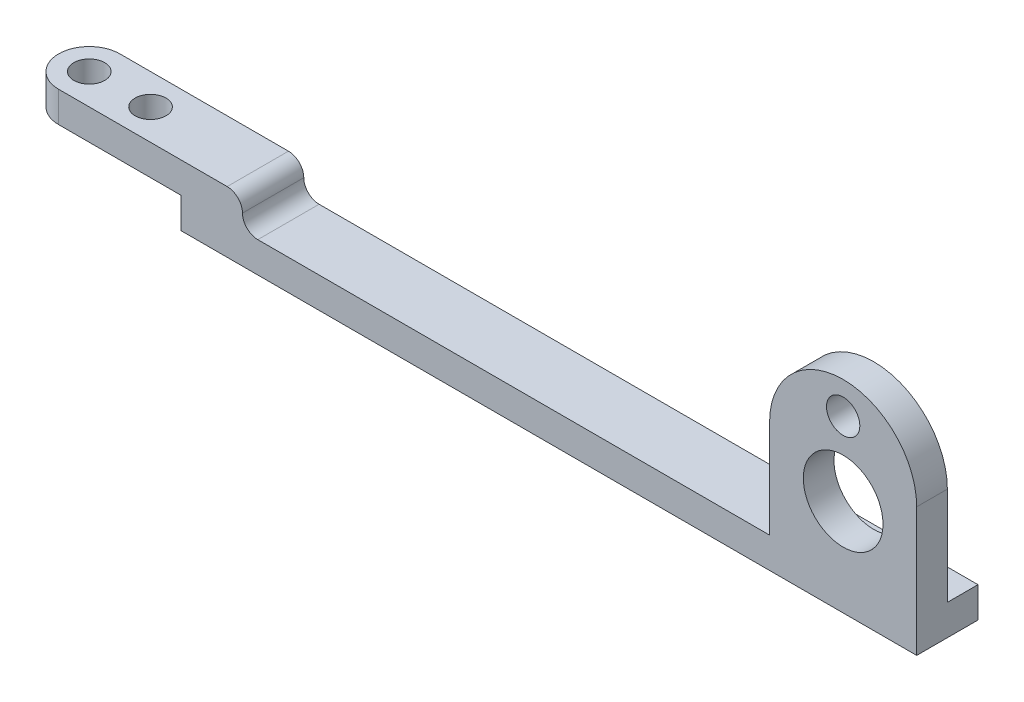
ISO-10303-21;
HEADER;
FILE_DESCRIPTION(('STEP AP214'),'2;1');
FILE_NAME('part.step','',(''),(''),'','','');
FILE_SCHEMA(('AUTOMOTIVE_DESIGN { 1 0 10303 214 1 1 1 1 }'));
ENDSEC;
DATA;
#1=APPLICATION_CONTEXT('core data for automotive mechanical design processes');
#2=APPLICATION_PROTOCOL_DEFINITION('international standard','automotive_design',2000,#1);
#3=PRODUCT_CONTEXT('',#1,'mechanical');
#4=PRODUCT('Part','Part','',(#3));
#5=PRODUCT_RELATED_PRODUCT_CATEGORY('part','',(#4));
#6=PRODUCT_DEFINITION_FORMATION('','',#4);
#7=PRODUCT_DEFINITION_CONTEXT('part definition',#1,'design');
#8=PRODUCT_DEFINITION('design','',#6,#7);
#9=PRODUCT_DEFINITION_SHAPE('','',#8);
#10=(LENGTH_UNIT() NAMED_UNIT(*) SI_UNIT(.MILLI.,.METRE.));
#11=(NAMED_UNIT(*) PLANE_ANGLE_UNIT() SI_UNIT($,.RADIAN.));
#12=(NAMED_UNIT(*) SI_UNIT($,.STERADIAN.) SOLID_ANGLE_UNIT());
#13=UNCERTAINTY_MEASURE_WITH_UNIT(LENGTH_MEASURE(1.E-05),#10,'distance_accuracy_value','');
#14=(GEOMETRIC_REPRESENTATION_CONTEXT(3) GLOBAL_UNCERTAINTY_ASSIGNED_CONTEXT((#13)) GLOBAL_UNIT_ASSIGNED_CONTEXT((#10,
#11,#12)) REPRESENTATION_CONTEXT('',''));
#15=CARTESIAN_POINT('',(0.,0.,0.));
#16=DIRECTION('',(0.,0.,1.));
#17=DIRECTION('',(1.,0.,0.));
#18=AXIS2_PLACEMENT_3D('',#15,#16,#17);
#19=CARTESIAN_POINT('',(0.,3.175,-3.175));
#20=DIRECTION('',(1.,0.,0.));
#21=DIRECTION('',(0.,0.,-1.));
#22=AXIS2_PLACEMENT_3D('',#19,#20,#21);
#23=PLANE('',#22);
#24=DIRECTION('',(0.,0.,1.));
#25=VECTOR('',#24,1.);
#26=CARTESIAN_POINT('',(0.,0.,-3.175));
#27=LINE('',#26,#25);
#28=CARTESIAN_POINT('',(0.,0.,-3.175));
#29=VERTEX_POINT('',#28);
#30=CARTESIAN_POINT('',(0.,0.,3.175));
#31=VERTEX_POINT('',#30);
#32=EDGE_CURVE('E203',#29,#31,#27,.T.);
#33=ORIENTED_EDGE('',*,*,#32,.T.);
#34=DIRECTION('',(0.,-1.,0.));
#35=VECTOR('',#34,1.);
#36=CARTESIAN_POINT('',(0.,3.175,3.175));
#37=LINE('',#36,#35);
#38=CARTESIAN_POINT('',(0.,3.175,3.175));
#39=VERTEX_POINT('',#38);
#40=EDGE_CURVE('E229',#39,#31,#37,.T.);
#41=ORIENTED_EDGE('',*,*,#40,.F.);
#42=DIRECTION('',(0.,0.,1.));
#43=VECTOR('',#42,1.);
#44=CARTESIAN_POINT('',(0.,3.175,-3.175));
#45=LINE('',#44,#43);
#46=CARTESIAN_POINT('',(0.,3.175,-3.175));
#47=VERTEX_POINT('',#46);
#48=EDGE_CURVE('E204',#47,#39,#45,.T.);
#49=ORIENTED_EDGE('',*,*,#48,.F.);
#50=DIRECTION('',(0.,-1.,0.));
#51=VECTOR('',#50,1.);
#52=CARTESIAN_POINT('',(0.,3.175,-3.175));
#53=LINE('',#52,#51);
#54=EDGE_CURVE('E214',#47,#29,#53,.T.);
#55=ORIENTED_EDGE('',*,*,#54,.T.);
#56=EDGE_LOOP('',(#33,#41,#49,#55));
#57=FACE_BOUND('',#56,.T.);
#58=ADVANCED_FACE('F45',(#57),#23,.F.);
#59=CARTESIAN_POINT('',(0.,3.175,3.175));
#60=DIRECTION('',(0.,0.,-1.));
#61=DIRECTION('',(-1.,0.,0.));
#62=AXIS2_PLACEMENT_3D('',#59,#60,#61);
#63=PLANE('',#62);
#64=DIRECTION('',(1.,0.,0.));
#65=VECTOR('',#64,1.);
#66=CARTESIAN_POINT('',(0.,3.175,3.175));
#67=LINE('',#66,#65);
#68=CARTESIAN_POINT('',(7.9375,3.175,3.175));
#69=VERTEX_POINT('',#68);
#70=CARTESIAN_POINT('',(60.96,3.175,3.175));
#71=VERTEX_POINT('',#70);
#72=EDGE_CURVE('E207',#69,#71,#67,.T.);
#73=ORIENTED_EDGE('',*,*,#72,.F.);
#74=CARTESIAN_POINT('',(7.9375,4.7625,3.175));
#75=DIRECTION('',(0.,0.,-1.));
#76=DIRECTION('',(-1.,0.,0.));
#77=AXIS2_PLACEMENT_3D('',#74,#75,#76);
#78=CIRCLE('',#77,1.5875);
#79=CARTESIAN_POINT('',(6.35,4.7625,3.175));
#80=VERTEX_POINT('',#79);
#81=EDGE_CURVE('E243',#69,#80,#78,.T.);
#82=ORIENTED_EDGE('',*,*,#81,.T.);
#83=CARTESIAN_POINT('',(4.7625,4.7625,3.175));
#84=DIRECTION('',(0.,0.,-1.));
#85=DIRECTION('',(-1.,0.,0.));
#86=AXIS2_PLACEMENT_3D('',#83,#84,#85);
#87=CIRCLE('',#86,1.5875);
#88=CARTESIAN_POINT('',(4.7625,6.35,3.175));
#89=VERTEX_POINT('',#88);
#90=EDGE_CURVE('E239',#80,#89,#87,.F.);
#91=ORIENTED_EDGE('',*,*,#90,.T.);
#92=DIRECTION('',(1.,0.,0.));
#93=VECTOR('',#92,1.);
#94=CARTESIAN_POINT('',(6.35,6.35,3.175));
#95=LINE('',#94,#93);
#96=CARTESIAN_POINT('',(-12.7,6.35,3.175));
#97=VERTEX_POINT('',#96);
#98=EDGE_CURVE('E189',#97,#89,#95,.T.);
#99=ORIENTED_EDGE('',*,*,#98,.F.);
#100=DIRECTION('',(0.,-1.,0.));
#101=VECTOR('',#100,1.);
#102=CARTESIAN_POINT('',(-12.7,6.35,3.175));
#103=LINE('',#102,#101);
#104=CARTESIAN_POINT('',(-12.7,3.175,3.175));
#105=VERTEX_POINT('',#104);
#106=EDGE_CURVE('E192',#97,#105,#103,.T.);
#107=ORIENTED_EDGE('',*,*,#106,.T.);
#108=DIRECTION('',(1.,0.,0.));
#109=VECTOR('',#108,1.);
#110=CARTESIAN_POINT('',(6.35,3.175,3.175));
#111=LINE('',#110,#109);
#112=EDGE_CURVE('E187',#105,#39,#111,.T.);
#113=ORIENTED_EDGE('',*,*,#112,.T.);
#114=ORIENTED_EDGE('',*,*,#40,.T.);
#115=DIRECTION('',(1.,0.,0.));
#116=VECTOR('',#115,1.);
#117=CARTESIAN_POINT('',(0.,0.,3.175));
#118=LINE('',#117,#116);
#119=CARTESIAN_POINT('',(76.2,0.,3.175));
#120=VERTEX_POINT('',#119);
#121=EDGE_CURVE('E217',#31,#120,#118,.T.);
#122=ORIENTED_EDGE('',*,*,#121,.T.);
#123=DIRECTION('',(0.,-1.,0.));
#124=VECTOR('',#123,1.);
#125=CARTESIAN_POINT('',(76.2,3.175,3.175));
#126=LINE('',#125,#124);
#127=CARTESIAN_POINT('',(76.2,13.335,3.175));
#128=VERTEX_POINT('',#127);
#129=EDGE_CURVE('E227',#128,#120,#126,.T.);
#130=ORIENTED_EDGE('',*,*,#129,.F.);
#131=CARTESIAN_POINT('',(68.58,13.335,3.175));
#132=DIRECTION('',(0.,0.,1.));
#133=DIRECTION('',(-1.,0.,0.));
#134=AXIS2_PLACEMENT_3D('',#131,#132,#133);
#135=CIRCLE('',#134,7.62000000000001);
#136=CARTESIAN_POINT('',(60.96,13.335,3.175));
#137=VERTEX_POINT('',#136);
#138=EDGE_CURVE('E140',#128,#137,#135,.T.);
#139=ORIENTED_EDGE('',*,*,#138,.T.);
#140=DIRECTION('',(0.,-1.,0.));
#141=VECTOR('',#140,1.);
#142=CARTESIAN_POINT('',(60.96,3.175,3.175));
#143=LINE('',#142,#141);
#144=EDGE_CURVE('E156',#137,#71,#143,.T.);
#145=ORIENTED_EDGE('',*,*,#144,.T.);
#146=EDGE_LOOP('',(#73,#82,#91,#99,#107,#113,#114,#122,#130,#139,#145));
#147=FACE_BOUND('',#146,.T.);
#148=CARTESIAN_POINT('',(68.58,17.653,3.175));
#149=DIRECTION('',(0.,0.,1.));
#150=DIRECTION('',(1.,0.,0.));
#151=AXIS2_PLACEMENT_3D('',#148,#149,#150);
#152=CIRCLE('',#151,1.725);
#153=CARTESIAN_POINT('',(70.305,17.653,3.175));
#154=VERTEX_POINT('',#153);
#155=EDGE_CURVE('E464',#154,#154,#152,.T.);
#156=ORIENTED_EDGE('',*,*,#155,.F.);
#157=EDGE_LOOP('',(#156));
#158=FACE_BOUND('',#157,.T.);
#159=CARTESIAN_POINT('',(68.58,10.033,3.175));
#160=DIRECTION('',(0.,0.,1.));
#161=DIRECTION('',(1.,0.,0.));
#162=AXIS2_PLACEMENT_3D('',#159,#160,#161);
#163=CIRCLE('',#162,4.12750000000001);
#164=CARTESIAN_POINT('',(72.7075,10.033,3.175));
#165=VERTEX_POINT('',#164);
#166=EDGE_CURVE('E161',#165,#165,#163,.T.);
#167=ORIENTED_EDGE('',*,*,#166,.F.);
#168=EDGE_LOOP('',(#167));
#169=FACE_BOUND('',#168,.T.);
#170=ADVANCED_FACE('F262',(#147,#158,#169),#63,.F.);
#171=CARTESIAN_POINT('',(76.2,3.175,-3.175));
#172=DIRECTION('',(-1.,0.,0.));
#173=DIRECTION('',(0.,0.,1.));
#174=AXIS2_PLACEMENT_3D('',#171,#172,#173);
#175=PLANE('',#174);
#176=DIRECTION('',(0.,0.,-1.));
#177=VECTOR('',#176,1.);
#178=CARTESIAN_POINT('',(76.2,0.,-3.175));
#179=LINE('',#178,#177);
#180=CARTESIAN_POINT('',(76.2,0.,-3.175));
#181=VERTEX_POINT('',#180);
#182=EDGE_CURVE('E219',#120,#181,#179,.T.);
#183=ORIENTED_EDGE('',*,*,#182,.T.);
#184=DIRECTION('',(0.,-1.,0.));
#185=VECTOR('',#184,1.);
#186=CARTESIAN_POINT('',(76.2,3.175,-3.175));
#187=LINE('',#186,#185);
#188=CARTESIAN_POINT('',(76.2,3.175,-3.175));
#189=VERTEX_POINT('',#188);
#190=EDGE_CURVE('E224',#189,#181,#187,.T.);
#191=ORIENTED_EDGE('',*,*,#190,.F.);
#192=DIRECTION('',(0.,0.,-1.));
#193=VECTOR('',#192,1.);
#194=CARTESIAN_POINT('',(76.2,3.175,-3.175));
#195=LINE('',#194,#193);
#196=CARTESIAN_POINT('',(76.2,3.175,0.));
#197=VERTEX_POINT('',#196);
#198=EDGE_CURVE('E155',#197,#189,#195,.T.);
#199=ORIENTED_EDGE('',*,*,#198,.F.);
#200=DIRECTION('',(0.,1.,0.));
#201=VECTOR('',#200,1.);
#202=CARTESIAN_POINT('',(76.2,3.175,0.));
#203=LINE('',#202,#201);
#204=CARTESIAN_POINT('',(76.2,13.335,0.));
#205=VERTEX_POINT('',#204);
#206=EDGE_CURVE('E150',#197,#205,#203,.T.);
#207=ORIENTED_EDGE('',*,*,#206,.T.);
#208=DIRECTION('',(0.,0.,1.));
#209=VECTOR('',#208,1.);
#210=CARTESIAN_POINT('',(76.2,13.335,0.));
#211=LINE('',#210,#209);
#212=EDGE_CURVE('E135',#205,#128,#211,.T.);
#213=ORIENTED_EDGE('',*,*,#212,.T.);
#214=ORIENTED_EDGE('',*,*,#129,.T.);
#215=EDGE_LOOP('',(#183,#191,#199,#207,#213,#214));
#216=FACE_BOUND('',#215,.T.);
#217=ADVANCED_FACE('F153',(#216),#175,.F.);
#218=CARTESIAN_POINT('',(0.,3.175,-3.175));
#219=DIRECTION('',(0.,0.,1.));
#220=DIRECTION('',(1.,0.,0.));
#221=AXIS2_PLACEMENT_3D('',#218,#219,#220);
#222=PLANE('',#221);
#223=DIRECTION('',(-1.,0.,0.));
#224=VECTOR('',#223,1.);
#225=CARTESIAN_POINT('',(6.34999999999999,6.35,-3.175));
#226=LINE('',#225,#224);
#227=CARTESIAN_POINT('',(4.76249999999999,6.35,-3.175));
#228=VERTEX_POINT('',#227);
#229=CARTESIAN_POINT('',(-12.7,6.35,-3.175));
#230=VERTEX_POINT('',#229);
#231=EDGE_CURVE('E184',#228,#230,#226,.T.);
#232=ORIENTED_EDGE('',*,*,#231,.F.);
#233=CARTESIAN_POINT('',(4.76249999999999,4.7625,-3.175));
#234=DIRECTION('',(0.,0.,1.));
#235=DIRECTION('',(1.,0.,0.));
#236=AXIS2_PLACEMENT_3D('',#233,#234,#235);
#237=CIRCLE('',#236,1.5875);
#238=CARTESIAN_POINT('',(6.34999999999999,4.7625,-3.175));
#239=VERTEX_POINT('',#238);
#240=EDGE_CURVE('E237',#228,#239,#237,.F.);
#241=ORIENTED_EDGE('',*,*,#240,.T.);
#242=CARTESIAN_POINT('',(7.93749999999999,4.7625,-3.175));
#243=DIRECTION('',(0.,0.,1.));
#244=DIRECTION('',(1.,0.,0.));
#245=AXIS2_PLACEMENT_3D('',#242,#243,#244);
#246=CIRCLE('',#245,1.5875);
#247=CARTESIAN_POINT('',(7.93749999999999,3.175,-3.175));
#248=VERTEX_POINT('',#247);
#249=EDGE_CURVE('E241',#239,#248,#246,.T.);
#250=ORIENTED_EDGE('',*,*,#249,.T.);
#251=DIRECTION('',(-1.,0.,0.));
#252=VECTOR('',#251,1.);
#253=CARTESIAN_POINT('',(0.,3.175,-3.175));
#254=LINE('',#253,#252);
#255=EDGE_CURVE('E211',#189,#248,#254,.T.);
#256=ORIENTED_EDGE('',*,*,#255,.F.);
#257=ORIENTED_EDGE('',*,*,#190,.T.);
#258=DIRECTION('',(-1.,0.,0.));
#259=VECTOR('',#258,1.);
#260=CARTESIAN_POINT('',(0.,0.,-3.175));
#261=LINE('',#260,#259);
#262=EDGE_CURVE('E208',#181,#29,#261,.T.);
#263=ORIENTED_EDGE('',*,*,#262,.T.);
#264=ORIENTED_EDGE('',*,*,#54,.F.);
#265=DIRECTION('',(-1.,0.,0.));
#266=VECTOR('',#265,1.);
#267=CARTESIAN_POINT('',(6.34999999999999,3.175,-3.175));
#268=LINE('',#267,#266);
#269=CARTESIAN_POINT('',(-12.7,3.175,-3.175));
#270=VERTEX_POINT('',#269);
#271=EDGE_CURVE('E181',#47,#270,#268,.T.);
#272=ORIENTED_EDGE('',*,*,#271,.T.);
#273=DIRECTION('',(0.,-1.,0.));
#274=VECTOR('',#273,1.);
#275=CARTESIAN_POINT('',(-12.7,6.35,-3.175));
#276=LINE('',#275,#274);
#277=EDGE_CURVE('E200',#230,#270,#276,.T.);
#278=ORIENTED_EDGE('',*,*,#277,.F.);
#279=EDGE_LOOP('',(#232,#241,#250,#256,#257,#263,#264,#272,#278));
#280=FACE_BOUND('',#279,.T.);
#281=ADVANCED_FACE('F300',(#280),#222,.F.);
#282=CARTESIAN_POINT('',(0.,3.175,0.));
#283=DIRECTION('',(0.,1.,0.));
#284=DIRECTION('',(0.,0.,1.));
#285=AXIS2_PLACEMENT_3D('',#282,#283,#284);
#286=PLANE('',#285);
#287=DIRECTION('',(0.,0.,1.));
#288=VECTOR('',#287,1.);
#289=CARTESIAN_POINT('',(60.96,3.175,0.));
#290=LINE('',#289,#288);
#291=CARTESIAN_POINT('',(60.96,3.175,0.));
#292=VERTEX_POINT('',#291);
#293=EDGE_CURVE('E61',#292,#71,#290,.T.);
#294=ORIENTED_EDGE('',*,*,#293,.F.);
#295=DIRECTION('',(1.,0.,0.));
#296=VECTOR('',#295,1.);
#297=CARTESIAN_POINT('',(76.2,3.175,0.));
#298=LINE('',#297,#296);
#299=EDGE_CURVE('E66',#292,#197,#298,.T.);
#300=ORIENTED_EDGE('',*,*,#299,.T.);
#301=ORIENTED_EDGE('',*,*,#198,.T.);
#302=ORIENTED_EDGE('',*,*,#255,.T.);
#303=DIRECTION('',(0.,0.,-1.));
#304=VECTOR('',#303,1.);
#305=CARTESIAN_POINT('',(7.9375,3.175,0.));
#306=LINE('',#305,#304);
#307=EDGE_CURVE('E232',#248,#69,#306,.F.);
#308=ORIENTED_EDGE('',*,*,#307,.T.);
#309=ORIENTED_EDGE('',*,*,#72,.T.);
#310=EDGE_LOOP('',(#294,#300,#301,#302,#308,#309));
#311=FACE_BOUND('',#310,.T.);
#312=ADVANCED_FACE('F312',(#311),#286,.T.);
#313=CARTESIAN_POINT('',(0.,0.,0.));
#314=DIRECTION('',(0.,1.,0.));
#315=DIRECTION('',(0.,0.,1.));
#316=AXIS2_PLACEMENT_3D('',#313,#314,#315);
#317=PLANE('',#316);
#318=ORIENTED_EDGE('',*,*,#32,.F.);
#319=ORIENTED_EDGE('',*,*,#262,.F.);
#320=ORIENTED_EDGE('',*,*,#182,.F.);
#321=ORIENTED_EDGE('',*,*,#121,.F.);
#322=EDGE_LOOP('',(#318,#319,#320,#321));
#323=FACE_BOUND('',#322,.T.);
#324=ADVANCED_FACE('F318',(#323),#317,.F.);
#325=CARTESIAN_POINT('',(-12.7,3.175,0.));
#326=DIRECTION('',(0.,1.,0.));
#327=DIRECTION('',(0.,0.,1.));
#328=AXIS2_PLACEMENT_3D('',#325,#326,#327);
#329=PLANE('',#328);
#330=CARTESIAN_POINT('',(-12.7,3.175,0.));
#331=DIRECTION('',(0.,1.,0.));
#332=DIRECTION('',(0.,0.,1.));
#333=AXIS2_PLACEMENT_3D('',#330,#331,#332);
#334=CIRCLE('',#333,1.6);
#335=CARTESIAN_POINT('',(-12.7,3.175,1.6));
#336=VERTEX_POINT('',#335);
#337=EDGE_CURVE('E174',#336,#336,#334,.T.);
#338=ORIENTED_EDGE('',*,*,#337,.T.);
#339=EDGE_LOOP('',(#338));
#340=FACE_BOUND('',#339,.T.);
#341=CARTESIAN_POINT('',(-6.35,3.175,0.));
#342=DIRECTION('',(0.,1.,0.));
#343=DIRECTION('',(0.,0.,1.));
#344=AXIS2_PLACEMENT_3D('',#341,#342,#343);
#345=CIRCLE('',#344,1.6);
#346=CARTESIAN_POINT('',(-6.35,3.175,1.6));
#347=VERTEX_POINT('',#346);
#348=EDGE_CURVE('E175',#347,#347,#345,.T.);
#349=ORIENTED_EDGE('',*,*,#348,.T.);
#350=EDGE_LOOP('',(#349));
#351=FACE_BOUND('',#350,.T.);
#352=ORIENTED_EDGE('',*,*,#271,.F.);
#353=ORIENTED_EDGE('',*,*,#48,.T.);
#354=ORIENTED_EDGE('',*,*,#112,.F.);
#355=CARTESIAN_POINT('',(-12.7,3.175,0.));
#356=DIRECTION('',(0.,1.,0.));
#357=DIRECTION('',(0.,0.,1.));
#358=AXIS2_PLACEMENT_3D('',#355,#356,#357);
#359=CIRCLE('',#358,3.175);
#360=EDGE_CURVE('E194',#270,#105,#359,.T.);
#361=ORIENTED_EDGE('',*,*,#360,.F.);
#362=EDGE_LOOP('',(#352,#353,#354,#361));
#363=FACE_BOUND('',#362,.T.);
#364=ADVANCED_FACE('F321',(#340,#351,#363),#329,.F.);
#365=CARTESIAN_POINT('',(-12.7,6.35,0.));
#366=DIRECTION('',(0.,1.,0.));
#367=DIRECTION('',(0.,0.,1.));
#368=AXIS2_PLACEMENT_3D('',#365,#366,#367);
#369=PLANE('',#368);
#370=CARTESIAN_POINT('',(-12.7,6.35,0.));
#371=DIRECTION('',(0.,1.,0.));
#372=DIRECTION('',(0.,0.,1.));
#373=AXIS2_PLACEMENT_3D('',#370,#371,#372);
#374=CIRCLE('',#373,1.6);
#375=CARTESIAN_POINT('',(-12.7,6.35,1.6));
#376=VERTEX_POINT('',#375);
#377=EDGE_CURVE('E178',#376,#376,#374,.T.);
#378=ORIENTED_EDGE('',*,*,#377,.F.);
#379=EDGE_LOOP('',(#378));
#380=FACE_BOUND('',#379,.T.);
#381=ORIENTED_EDGE('',*,*,#98,.T.);
#382=DIRECTION('',(0.,0.,-1.));
#383=VECTOR('',#382,1.);
#384=CARTESIAN_POINT('',(4.76249999999999,6.35,-3.175));
#385=LINE('',#384,#383);
#386=EDGE_CURVE('E235',#89,#228,#385,.T.);
#387=ORIENTED_EDGE('',*,*,#386,.T.);
#388=ORIENTED_EDGE('',*,*,#231,.T.);
#389=CARTESIAN_POINT('',(-12.7,6.35,0.));
#390=DIRECTION('',(0.,1.,0.));
#391=DIRECTION('',(0.,0.,1.));
#392=AXIS2_PLACEMENT_3D('',#389,#390,#391);
#393=CIRCLE('',#392,3.175);
#394=EDGE_CURVE('E186',#230,#97,#393,.T.);
#395=ORIENTED_EDGE('',*,*,#394,.T.);
#396=EDGE_LOOP('',(#381,#387,#388,#395));
#397=FACE_BOUND('',#396,.T.);
#398=CARTESIAN_POINT('',(-6.35,6.35,0.));
#399=DIRECTION('',(0.,1.,0.));
#400=DIRECTION('',(0.,0.,1.));
#401=AXIS2_PLACEMENT_3D('',#398,#399,#400);
#402=CIRCLE('',#401,1.6);
#403=CARTESIAN_POINT('',(-6.35,6.35,1.6));
#404=VERTEX_POINT('',#403);
#405=EDGE_CURVE('E171',#404,#404,#402,.T.);
#406=ORIENTED_EDGE('',*,*,#405,.F.);
#407=EDGE_LOOP('',(#406));
#408=FACE_BOUND('',#407,.T.);
#409=ADVANCED_FACE('F295',(#380,#397,#408),#369,.T.);
#410=CARTESIAN_POINT('',(-12.7,6.35,0.));
#411=DIRECTION('',(0.,-1.,0.));
#412=DIRECTION('',(0.,0.,-1.));
#413=AXIS2_PLACEMENT_3D('',#410,#411,#412);
#414=CYLINDRICAL_SURFACE('',#413,3.175);
#415=ORIENTED_EDGE('',*,*,#360,.T.);
#416=ORIENTED_EDGE('',*,*,#106,.F.);
#417=ORIENTED_EDGE('',*,*,#394,.F.);
#418=ORIENTED_EDGE('',*,*,#277,.T.);
#419=EDGE_LOOP('',(#415,#416,#417,#418));
#420=FACE_BOUND('',#419,.T.);
#421=ADVANCED_FACE('F306',(#420),#414,.T.);
#422=CARTESIAN_POINT('',(-12.7,6.35,0.));
#423=DIRECTION('',(0.,-1.,0.));
#424=DIRECTION('',(0.,0.,-1.));
#425=AXIS2_PLACEMENT_3D('',#422,#423,#424);
#426=CYLINDRICAL_SURFACE('',#425,1.6);
#427=ORIENTED_EDGE('',*,*,#377,.T.);
#428=EDGE_LOOP('',(#427));
#429=FACE_BOUND('',#428,.T.);
#430=ORIENTED_EDGE('',*,*,#337,.F.);
#431=EDGE_LOOP('',(#430));
#432=FACE_BOUND('',#431,.T.);
#433=ADVANCED_FACE('F286',(#429,#432),#426,.F.);
#434=CARTESIAN_POINT('',(-6.35,6.35,0.));
#435=DIRECTION('',(0.,-1.,0.));
#436=DIRECTION('',(0.,0.,-1.));
#437=AXIS2_PLACEMENT_3D('',#434,#435,#436);
#438=CYLINDRICAL_SURFACE('',#437,1.6);
#439=ORIENTED_EDGE('',*,*,#405,.T.);
#440=EDGE_LOOP('',(#439));
#441=FACE_BOUND('',#440,.T.);
#442=ORIENTED_EDGE('',*,*,#348,.F.);
#443=EDGE_LOOP('',(#442));
#444=FACE_BOUND('',#443,.T.);
#445=ADVANCED_FACE('F280',(#441,#444),#438,.F.);
#446=CARTESIAN_POINT('',(4.7625,4.7625,0.));
#447=DIRECTION('',(0.,0.,1.));
#448=DIRECTION('',(1.,0.,0.));
#449=AXIS2_PLACEMENT_3D('',#446,#447,#448);
#450=CYLINDRICAL_SURFACE('',#449,1.5875);
#451=ORIENTED_EDGE('',*,*,#386,.F.);
#452=ORIENTED_EDGE('',*,*,#90,.F.);
#453=DIRECTION('',(0.,0.,-1.));
#454=VECTOR('',#453,1.);
#455=CARTESIAN_POINT('',(6.35,4.7625,3.175));
#456=LINE('',#455,#454);
#457=EDGE_CURVE('E169',#239,#80,#456,.F.);
#458=ORIENTED_EDGE('',*,*,#457,.F.);
#459=ORIENTED_EDGE('',*,*,#240,.F.);
#460=EDGE_LOOP('',(#451,#452,#458,#459));
#461=FACE_BOUND('',#460,.T.);
#462=ADVANCED_FACE('F277',(#461),#450,.T.);
#463=CARTESIAN_POINT('',(7.93749999999999,4.7625,-3.175));
#464=DIRECTION('',(0.,0.,-1.));
#465=DIRECTION('',(-1.,0.,0.));
#466=AXIS2_PLACEMENT_3D('',#463,#464,#465);
#467=CYLINDRICAL_SURFACE('',#466,1.5875);
#468=ORIENTED_EDGE('',*,*,#81,.F.);
#469=ORIENTED_EDGE('',*,*,#307,.F.);
#470=ORIENTED_EDGE('',*,*,#249,.F.);
#471=ORIENTED_EDGE('',*,*,#457,.T.);
#472=EDGE_LOOP('',(#468,#469,#470,#471));
#473=FACE_BOUND('',#472,.T.);
#474=ADVANCED_FACE('F274',(#473),#467,.F.);
#475=CARTESIAN_POINT('',(60.96,3.175,0.));
#476=DIRECTION('',(-1.,0.,0.));
#477=DIRECTION('',(0.,0.,1.));
#478=AXIS2_PLACEMENT_3D('',#475,#476,#477);
#479=PLANE('',#478);
#480=ORIENTED_EDGE('',*,*,#144,.F.);
#481=DIRECTION('',(0.,0.,1.));
#482=VECTOR('',#481,1.);
#483=CARTESIAN_POINT('',(60.96,13.335,0.));
#484=LINE('',#483,#482);
#485=CARTESIAN_POINT('',(60.96,13.335,0.));
#486=VERTEX_POINT('',#485);
#487=EDGE_CURVE('E144',#486,#137,#484,.T.);
#488=ORIENTED_EDGE('',*,*,#487,.F.);
#489=DIRECTION('',(0.,-1.,0.));
#490=VECTOR('',#489,1.);
#491=CARTESIAN_POINT('',(60.96,3.175,0.));
#492=LINE('',#491,#490);
#493=EDGE_CURVE('E151',#486,#292,#492,.T.);
#494=ORIENTED_EDGE('',*,*,#493,.T.);
#495=ORIENTED_EDGE('',*,*,#293,.T.);
#496=EDGE_LOOP('',(#480,#488,#494,#495));
#497=FACE_BOUND('',#496,.T.);
#498=ADVANCED_FACE('F276',(#497),#479,.T.);
#499=CARTESIAN_POINT('',(68.58,13.335,0.));
#500=DIRECTION('',(0.,0.,1.));
#501=DIRECTION('',(1.,0.,0.));
#502=AXIS2_PLACEMENT_3D('',#499,#500,#501);
#503=CYLINDRICAL_SURFACE('',#502,7.62000000000001);
#504=ORIENTED_EDGE('',*,*,#138,.F.);
#505=ORIENTED_EDGE('',*,*,#212,.F.);
#506=CARTESIAN_POINT('',(68.58,13.335,0.));
#507=DIRECTION('',(0.,0.,1.));
#508=DIRECTION('',(-1.,0.,0.));
#509=AXIS2_PLACEMENT_3D('',#506,#507,#508);
#510=CIRCLE('',#509,7.62000000000001);
#511=EDGE_CURVE('E138',#205,#486,#510,.T.);
#512=ORIENTED_EDGE('',*,*,#511,.T.);
#513=ORIENTED_EDGE('',*,*,#487,.T.);
#514=EDGE_LOOP('',(#504,#505,#512,#513));
#515=FACE_BOUND('',#514,.T.);
#516=ADVANCED_FACE('F137',(#515),#503,.T.);
#517=CARTESIAN_POINT('',(68.58,13.335,0.));
#518=DIRECTION('',(0.,0.,-1.));
#519=DIRECTION('',(-1.,0.,0.));
#520=AXIS2_PLACEMENT_3D('',#517,#518,#519);
#521=PLANE('',#520);
#522=CARTESIAN_POINT('',(68.58,17.653,0.));
#523=DIRECTION('',(0.,0.,-1.));
#524=DIRECTION('',(-1.,0.,0.));
#525=AXIS2_PLACEMENT_3D('',#522,#523,#524);
#526=CIRCLE('',#525,1.97900000000002);
#527=CARTESIAN_POINT('',(66.601,17.653,0.));
#528=VERTEX_POINT('',#527);
#529=EDGE_CURVE('E54',#528,#528,#526,.F.);
#530=ORIENTED_EDGE('',*,*,#529,.T.);
#531=EDGE_LOOP('',(#530));
#532=FACE_BOUND('',#531,.T.);
#533=CARTESIAN_POINT('',(68.58,10.033,0.));
#534=DIRECTION('',(0.,0.,1.));
#535=DIRECTION('',(1.,0.,0.));
#536=AXIS2_PLACEMENT_3D('',#533,#534,#535);
#537=CIRCLE('',#536,4.12750000000001);
#538=CARTESIAN_POINT('',(72.7075,10.033,0.));
#539=VERTEX_POINT('',#538);
#540=EDGE_CURVE('E166',#539,#539,#537,.T.);
#541=ORIENTED_EDGE('',*,*,#540,.T.);
#542=EDGE_LOOP('',(#541));
#543=FACE_BOUND('',#542,.T.);
#544=ORIENTED_EDGE('',*,*,#206,.F.);
#545=ORIENTED_EDGE('',*,*,#299,.F.);
#546=ORIENTED_EDGE('',*,*,#493,.F.);
#547=ORIENTED_EDGE('',*,*,#511,.F.);
#548=EDGE_LOOP('',(#544,#545,#546,#547));
#549=FACE_BOUND('',#548,.T.);
#550=ADVANCED_FACE('F149',(#532,#543,#549),#521,.T.);
#551=CARTESIAN_POINT('',(68.58,10.033,0.));
#552=DIRECTION('',(0.,0.,1.));
#553=DIRECTION('',(1.,0.,0.));
#554=AXIS2_PLACEMENT_3D('',#551,#552,#553);
#555=CYLINDRICAL_SURFACE('',#554,4.12750000000001);
#556=ORIENTED_EDGE('',*,*,#540,.F.);
#557=EDGE_LOOP('',(#556));
#558=FACE_BOUND('',#557,.T.);
#559=ORIENTED_EDGE('',*,*,#166,.T.);
#560=EDGE_LOOP('',(#559));
#561=FACE_BOUND('',#560,.T.);
#562=ADVANCED_FACE('F257',(#558,#561),#555,.F.);
#563=CARTESIAN_POINT('',(68.58,17.653,0.));
#564=DIRECTION('',(0.,0.,1.));
#565=DIRECTION('',(1.,0.,0.));
#566=AXIS2_PLACEMENT_3D('',#563,#564,#565);
#567=CYLINDRICAL_SURFACE('',#566,1.725);
#568=CARTESIAN_POINT('',(68.58,17.653,0.254000000000015));
#569=DIRECTION('',(0.,0.,-1.));
#570=DIRECTION('',(-1.,0.,0.));
#571=AXIS2_PLACEMENT_3D('',#568,#569,#570);
#572=CIRCLE('',#571,1.725);
#573=CARTESIAN_POINT('',(66.855,17.653,0.254000000000015));
#574=VERTEX_POINT('',#573);
#575=EDGE_CURVE('E11',#574,#574,#572,.T.);
#576=ORIENTED_EDGE('',*,*,#575,.T.);
#577=EDGE_LOOP('',(#576));
#578=FACE_BOUND('',#577,.T.);
#579=ORIENTED_EDGE('',*,*,#155,.T.);
#580=EDGE_LOOP('',(#579));
#581=FACE_BOUND('',#580,.T.);
#582=ADVANCED_FACE('F252',(#578,#581),#567,.F.);
#583=CARTESIAN_POINT('',(68.58,17.653,0.));
#584=DIRECTION('',(0.,0.,-1.));
#585=DIRECTION('',(-1.,0.,0.));
#586=AXIS2_PLACEMENT_3D('',#583,#584,#585);
#587=CONICAL_SURFACE('',#586,1.97900000000002,0.785398163397464);
#588=ORIENTED_EDGE('',*,*,#575,.F.);
#589=EDGE_LOOP('',(#588));
#590=FACE_BOUND('',#589,.T.);
#591=ORIENTED_EDGE('',*,*,#529,.F.);
#592=EDGE_LOOP('',(#591));
#593=FACE_BOUND('',#592,.T.);
#594=ADVANCED_FACE('F48',(#590,#593),#587,.F.);
#595=CLOSED_SHELL('',(#58,#170,#217,#281,#312,#324,#364,#409,#421,#433,#445,#462,#474,#498,#516,
#550,#562,#582,#594));
#596=MANIFOLD_SOLID_BREP('B2',#595);
#597=ADVANCED_BREP_SHAPE_REPRESENTATION('',(#18,#596),#14);
#598=SHAPE_DEFINITION_REPRESENTATION(#9,#597);
ENDSEC;
END-ISO-10303-21;
